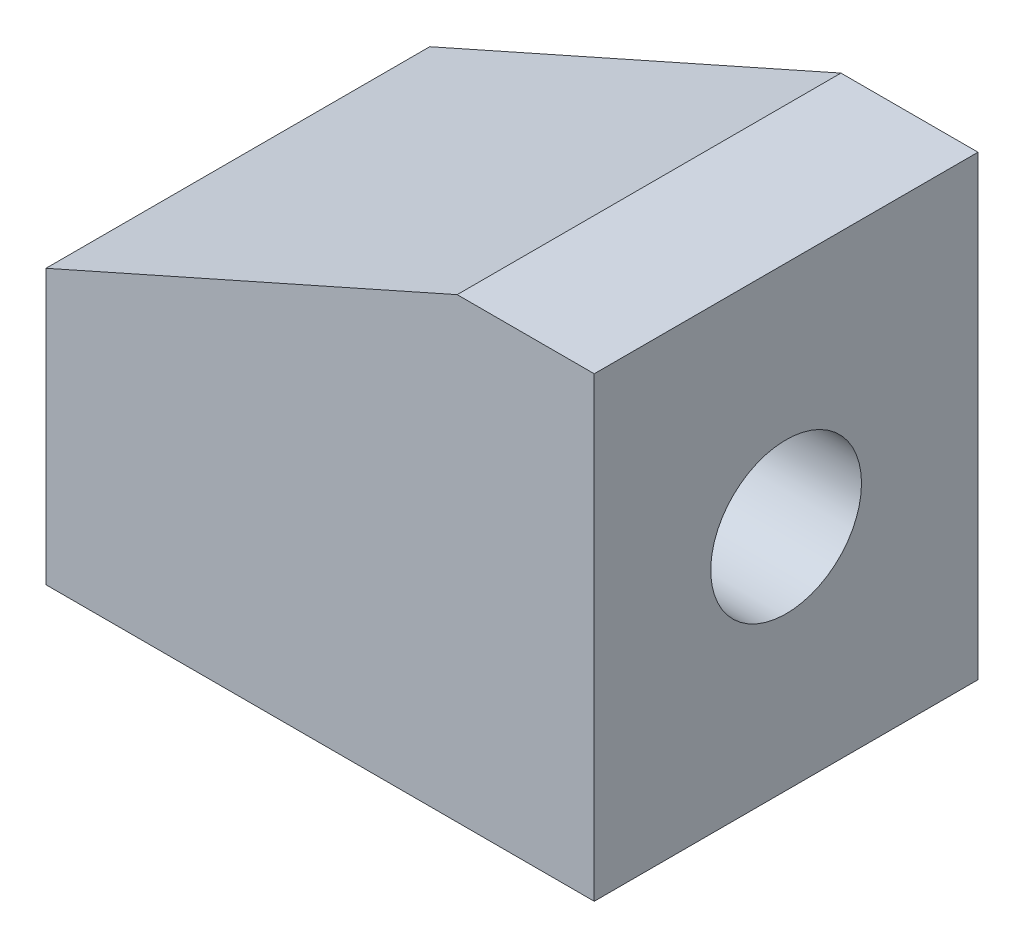
ISO-10303-21;
HEADER;
FILE_DESCRIPTION(('STEP AP214'),'2;1');
FILE_NAME('part.step','',(''),(''),'','','');
FILE_SCHEMA(('AUTOMOTIVE_DESIGN { 1 0 10303 214 1 1 1 1 }'));
ENDSEC;
DATA;
#1=APPLICATION_CONTEXT('core data for automotive mechanical design processes');
#2=APPLICATION_PROTOCOL_DEFINITION('international standard','automotive_design',2000,#1);
#3=PRODUCT_CONTEXT('',#1,'mechanical');
#4=PRODUCT('Part','Part','',(#3));
#5=PRODUCT_RELATED_PRODUCT_CATEGORY('part','',(#4));
#6=PRODUCT_DEFINITION_FORMATION('','',#4);
#7=PRODUCT_DEFINITION_CONTEXT('part definition',#1,'design');
#8=PRODUCT_DEFINITION('design','',#6,#7);
#9=PRODUCT_DEFINITION_SHAPE('','',#8);
#10=(LENGTH_UNIT() NAMED_UNIT(*) SI_UNIT(.MILLI.,.METRE.));
#11=(NAMED_UNIT(*) PLANE_ANGLE_UNIT() SI_UNIT($,.RADIAN.));
#12=(NAMED_UNIT(*) SI_UNIT($,.STERADIAN.) SOLID_ANGLE_UNIT());
#13=UNCERTAINTY_MEASURE_WITH_UNIT(LENGTH_MEASURE(1.E-05),#10,'distance_accuracy_value','');
#14=(GEOMETRIC_REPRESENTATION_CONTEXT(3) GLOBAL_UNCERTAINTY_ASSIGNED_CONTEXT((#13)) GLOBAL_UNIT_ASSIGNED_CONTEXT((#10,
#11,#12)) REPRESENTATION_CONTEXT('',''));
#15=CARTESIAN_POINT('',(0.,0.,0.));
#16=DIRECTION('',(0.,0.,1.));
#17=DIRECTION('',(1.,0.,0.));
#18=AXIS2_PLACEMENT_3D('',#15,#16,#17);
#19=CARTESIAN_POINT('',(45.,20.,42.));
#20=DIRECTION('',(0.406138466053448,-0.913811548620257,0.));
#21=DIRECTION('',(0.913811548620257,0.406138466053448,0.));
#22=AXIS2_PLACEMENT_3D('',#19,#20,#21);
#23=PLANE('',#22);
#24=DIRECTION('',(-0.913811548620257,-0.406138466053448,0.));
#25=VECTOR('',#24,1.);
#26=CARTESIAN_POINT('',(45.,20.,0.));
#27=LINE('',#26,#25);
#28=CARTESIAN_POINT('',(45.,20.,0.));
#29=VERTEX_POINT('',#28);
#30=CARTESIAN_POINT('',(0.,0.,0.));
#31=VERTEX_POINT('',#30);
#32=EDGE_CURVE('E123',#29,#31,#27,.T.);
#33=ORIENTED_EDGE('',*,*,#32,.T.);
#34=DIRECTION('',(0.,0.,-1.));
#35=VECTOR('',#34,1.);
#36=CARTESIAN_POINT('',(0.,0.,42.));
#37=LINE('',#36,#35);
#38=CARTESIAN_POINT('',(0.,0.,42.));
#39=VERTEX_POINT('',#38);
#40=EDGE_CURVE('E11',#39,#31,#37,.T.);
#41=ORIENTED_EDGE('',*,*,#40,.F.);
#42=DIRECTION('',(-0.913811548620257,-0.406138466053448,0.));
#43=VECTOR('',#42,1.);
#44=CARTESIAN_POINT('',(45.,20.,42.));
#45=LINE('',#44,#43);
#46=CARTESIAN_POINT('',(45.,20.,42.));
#47=VERTEX_POINT('',#46);
#48=EDGE_CURVE('E137',#47,#39,#45,.T.);
#49=ORIENTED_EDGE('',*,*,#48,.F.);
#50=DIRECTION('',(0.,0.,-1.));
#51=VECTOR('',#50,1.);
#52=CARTESIAN_POINT('',(45.,20.,42.));
#53=LINE('',#52,#51);
#54=EDGE_CURVE('E119',#47,#29,#53,.T.);
#55=ORIENTED_EDGE('',*,*,#54,.T.);
#56=EDGE_LOOP('',(#33,#41,#49,#55));
#57=FACE_BOUND('',#56,.T.);
#58=ADVANCED_FACE('F42',(#57),#23,.F.);
#59=CARTESIAN_POINT('',(0.,0.,42.));
#60=DIRECTION('',(1.,0.,0.));
#61=DIRECTION('',(0.,0.,-1.));
#62=AXIS2_PLACEMENT_3D('',#59,#60,#61);
#63=PLANE('',#62);
#64=DIRECTION('',(0.,-1.,0.));
#65=VECTOR('',#64,1.);
#66=CARTESIAN_POINT('',(0.,0.,0.));
#67=LINE('',#66,#65);
#68=CARTESIAN_POINT('',(0.,-30.,0.));
#69=VERTEX_POINT('',#68);
#70=EDGE_CURVE('E127',#31,#69,#67,.T.);
#71=ORIENTED_EDGE('',*,*,#70,.T.);
#72=DIRECTION('',(0.,0.,-1.));
#73=VECTOR('',#72,1.);
#74=CARTESIAN_POINT('',(0.,-30.,42.));
#75=LINE('',#74,#73);
#76=CARTESIAN_POINT('',(0.,-30.,42.));
#77=VERTEX_POINT('',#76);
#78=EDGE_CURVE('E51',#77,#69,#75,.T.);
#79=ORIENTED_EDGE('',*,*,#78,.F.);
#80=DIRECTION('',(0.,-1.,0.));
#81=VECTOR('',#80,1.);
#82=CARTESIAN_POINT('',(0.,0.,42.));
#83=LINE('',#82,#81);
#84=EDGE_CURVE('E94',#39,#77,#83,.T.);
#85=ORIENTED_EDGE('',*,*,#84,.F.);
#86=ORIENTED_EDGE('',*,*,#40,.T.);
#87=EDGE_LOOP('',(#71,#79,#85,#86));
#88=FACE_BOUND('',#87,.T.);
#89=ADVANCED_FACE('F161',(#88),#63,.F.);
#90=CARTESIAN_POINT('',(0.,-30.,42.));
#91=DIRECTION('',(0.,1.,0.));
#92=DIRECTION('',(0.,0.,1.));
#93=AXIS2_PLACEMENT_3D('',#90,#91,#92);
#94=PLANE('',#93);
#95=DIRECTION('',(1.,0.,0.));
#96=VECTOR('',#95,1.);
#97=CARTESIAN_POINT('',(0.,-30.,0.));
#98=LINE('',#97,#96);
#99=CARTESIAN_POINT('',(60.,-30.,0.));
#100=VERTEX_POINT('',#99);
#101=EDGE_CURVE('E111',#69,#100,#98,.T.);
#102=ORIENTED_EDGE('',*,*,#101,.T.);
#103=DIRECTION('',(0.,0.,-1.));
#104=VECTOR('',#103,1.);
#105=CARTESIAN_POINT('',(60.,-30.,42.));
#106=LINE('',#105,#104);
#107=CARTESIAN_POINT('',(60.,-30.,42.));
#108=VERTEX_POINT('',#107);
#109=EDGE_CURVE('E108',#108,#100,#106,.T.);
#110=ORIENTED_EDGE('',*,*,#109,.F.);
#111=DIRECTION('',(1.,0.,0.));
#112=VECTOR('',#111,1.);
#113=CARTESIAN_POINT('',(0.,-30.,42.));
#114=LINE('',#113,#112);
#115=EDGE_CURVE('E99',#77,#108,#114,.T.);
#116=ORIENTED_EDGE('',*,*,#115,.F.);
#117=ORIENTED_EDGE('',*,*,#78,.T.);
#118=EDGE_LOOP('',(#102,#110,#116,#117));
#119=FACE_BOUND('',#118,.T.);
#120=ADVANCED_FACE('F109',(#119),#94,.F.);
#121=CARTESIAN_POINT('',(60.,-30.,42.));
#122=DIRECTION('',(-1.,0.,0.));
#123=DIRECTION('',(0.,0.,1.));
#124=AXIS2_PLACEMENT_3D('',#121,#122,#123);
#125=PLANE('',#124);
#126=CARTESIAN_POINT('',(60.,-5.,21.));
#127=DIRECTION('',(1.,0.,0.));
#128=DIRECTION('',(0.,0.,-1.));
#129=AXIS2_PLACEMENT_3D('',#126,#127,#128);
#130=CIRCLE('',#129,8.24999999999999);
#131=CARTESIAN_POINT('',(60.,-5.,12.75));
#132=VERTEX_POINT('',#131);
#133=EDGE_CURVE('E224',#132,#132,#130,.T.);
#134=ORIENTED_EDGE('',*,*,#133,.F.);
#135=EDGE_LOOP('',(#134));
#136=FACE_BOUND('',#135,.T.);
#137=DIRECTION('',(0.,1.,0.));
#138=VECTOR('',#137,1.);
#139=CARTESIAN_POINT('',(60.,-30.,0.));
#140=LINE('',#139,#138);
#141=CARTESIAN_POINT('',(60.,20.,0.));
#142=VERTEX_POINT('',#141);
#143=EDGE_CURVE('E80',#100,#142,#140,.T.);
#144=ORIENTED_EDGE('',*,*,#143,.T.);
#145=DIRECTION('',(0.,0.,-1.));
#146=VECTOR('',#145,1.);
#147=CARTESIAN_POINT('',(60.,20.,42.));
#148=LINE('',#147,#146);
#149=CARTESIAN_POINT('',(60.,20.,42.));
#150=VERTEX_POINT('',#149);
#151=EDGE_CURVE('E113',#150,#142,#148,.T.);
#152=ORIENTED_EDGE('',*,*,#151,.F.);
#153=DIRECTION('',(0.,1.,0.));
#154=VECTOR('',#153,1.);
#155=CARTESIAN_POINT('',(60.,-30.,42.));
#156=LINE('',#155,#154);
#157=EDGE_CURVE('E103',#108,#150,#156,.T.);
#158=ORIENTED_EDGE('',*,*,#157,.F.);
#159=ORIENTED_EDGE('',*,*,#109,.T.);
#160=EDGE_LOOP('',(#144,#152,#158,#159));
#161=FACE_BOUND('',#160,.T.);
#162=ADVANCED_FACE('F115',(#136,#161),#125,.F.);
#163=CARTESIAN_POINT('',(60.,20.,42.));
#164=DIRECTION('',(0.,-1.,0.));
#165=DIRECTION('',(0.,0.,-1.));
#166=AXIS2_PLACEMENT_3D('',#163,#164,#165);
#167=PLANE('',#166);
#168=DIRECTION('',(-1.,0.,0.));
#169=VECTOR('',#168,1.);
#170=CARTESIAN_POINT('',(60.,20.,0.));
#171=LINE('',#170,#169);
#172=EDGE_CURVE('E86',#142,#29,#171,.T.);
#173=ORIENTED_EDGE('',*,*,#172,.T.);
#174=ORIENTED_EDGE('',*,*,#54,.F.);
#175=DIRECTION('',(-1.,0.,0.));
#176=VECTOR('',#175,1.);
#177=CARTESIAN_POINT('',(60.,20.,42.));
#178=LINE('',#177,#176);
#179=EDGE_CURVE('E59',#150,#47,#178,.T.);
#180=ORIENTED_EDGE('',*,*,#179,.F.);
#181=ORIENTED_EDGE('',*,*,#151,.T.);
#182=EDGE_LOOP('',(#173,#174,#180,#181));
#183=FACE_BOUND('',#182,.T.);
#184=ADVANCED_FACE('F148',(#183),#167,.F.);
#185=CARTESIAN_POINT('',(0.,0.,42.));
#186=DIRECTION('',(0.,0.,1.));
#187=DIRECTION('',(1.,0.,0.));
#188=AXIS2_PLACEMENT_3D('',#185,#186,#187);
#189=PLANE('',#188);
#190=ORIENTED_EDGE('',*,*,#48,.T.);
#191=ORIENTED_EDGE('',*,*,#84,.T.);
#192=ORIENTED_EDGE('',*,*,#115,.T.);
#193=ORIENTED_EDGE('',*,*,#157,.T.);
#194=ORIENTED_EDGE('',*,*,#179,.T.);
#195=EDGE_LOOP('',(#190,#191,#192,#193,#194));
#196=FACE_BOUND('',#195,.T.);
#197=ADVANCED_FACE('F101',(#196),#189,.T.);
#198=CARTESIAN_POINT('',(0.,0.,0.));
#199=DIRECTION('',(0.,0.,1.));
#200=DIRECTION('',(1.,0.,0.));
#201=AXIS2_PLACEMENT_3D('',#198,#199,#200);
#202=PLANE('',#201);
#203=ORIENTED_EDGE('',*,*,#32,.F.);
#204=ORIENTED_EDGE('',*,*,#172,.F.);
#205=ORIENTED_EDGE('',*,*,#143,.F.);
#206=ORIENTED_EDGE('',*,*,#101,.F.);
#207=ORIENTED_EDGE('',*,*,#70,.F.);
#208=EDGE_LOOP('',(#203,#204,#205,#206,#207));
#209=FACE_BOUND('',#208,.T.);
#210=ADVANCED_FACE('F144',(#209),#202,.F.);
#211=CARTESIAN_POINT('',(16.5,-5.,21.));
#212=DIRECTION('',(1.,0.,0.));
#213=DIRECTION('',(0.,0.,-1.));
#214=AXIS2_PLACEMENT_3D('',#211,#212,#213);
#215=CONICAL_SURFACE('',#214,8.24999999999999,1.02974425867665);
#216=CARTESIAN_POINT('',(11.5428998930226,-5.00000000000001,21.));
#217=VERTEX_POINT('',#216);
#218=VERTEX_LOOP('',#217);
#219=FACE_BOUND('',#218,.T.);
#220=CARTESIAN_POINT('',(16.5,-5.,21.));
#221=DIRECTION('',(1.,0.,0.));
#222=DIRECTION('',(0.,0.,-1.));
#223=AXIS2_PLACEMENT_3D('',#220,#221,#222);
#224=CIRCLE('',#223,8.24999999999999);
#225=CARTESIAN_POINT('',(16.5,-5.,12.75));
#226=VERTEX_POINT('',#225);
#227=EDGE_CURVE('E128',#226,#226,#224,.T.);
#228=ORIENTED_EDGE('',*,*,#227,.T.);
#229=EDGE_LOOP('',(#228));
#230=FACE_BOUND('',#229,.T.);
#231=ADVANCED_FACE('F185',(#219,#230),#215,.F.);
#232=CARTESIAN_POINT('',(60.,-5.,21.));
#233=DIRECTION('',(1.,0.,0.));
#234=DIRECTION('',(0.,0.,-1.));
#235=AXIS2_PLACEMENT_3D('',#232,#233,#234);
#236=CYLINDRICAL_SURFACE('',#235,8.24999999999999);
#237=ORIENTED_EDGE('',*,*,#227,.F.);
#238=EDGE_LOOP('',(#237));
#239=FACE_BOUND('',#238,.T.);
#240=ORIENTED_EDGE('',*,*,#133,.T.);
#241=EDGE_LOOP('',(#240));
#242=FACE_BOUND('',#241,.T.);
#243=ADVANCED_FACE('F190',(#239,#242),#236,.F.);
#244=CLOSED_SHELL('',(#58,#89,#120,#162,#184,#197,#210,#231,#243));
#245=MANIFOLD_SOLID_BREP('B2',#244);
#246=ADVANCED_BREP_SHAPE_REPRESENTATION('',(#18,#245),#14);
#247=SHAPE_DEFINITION_REPRESENTATION(#9,#246);
ENDSEC;
END-ISO-10303-21;
